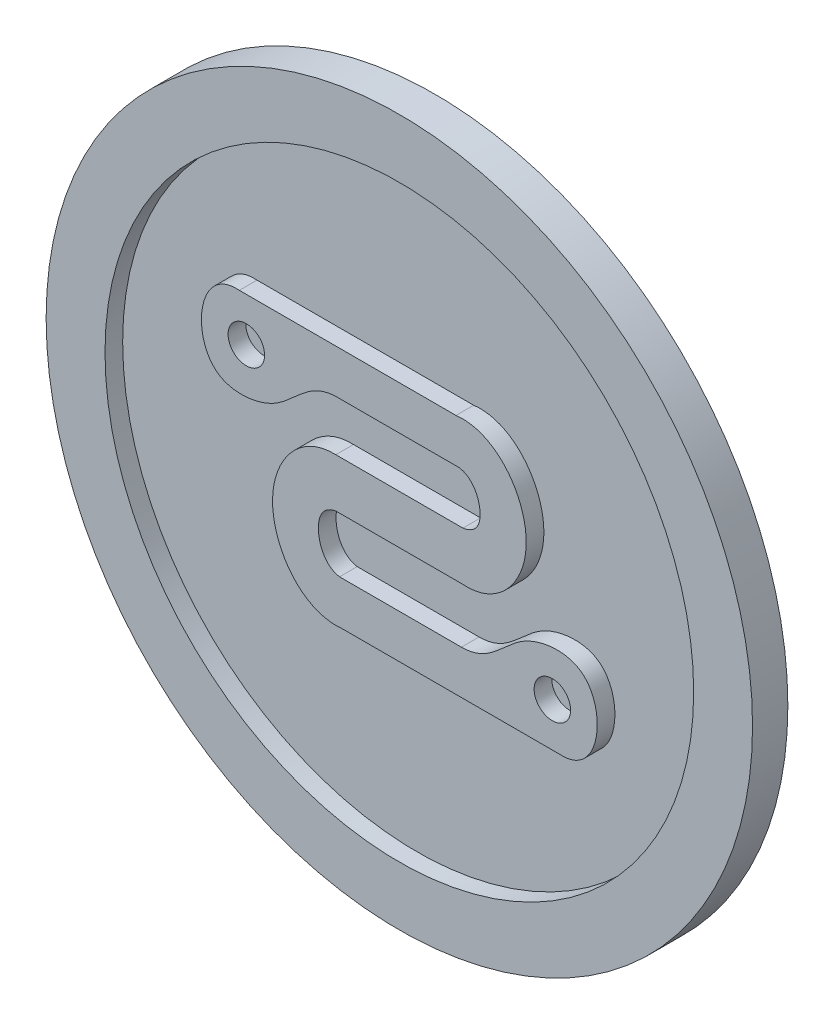
ISO-10303-21;
HEADER;
FILE_DESCRIPTION(('STEP AP214'),'2;1');
FILE_NAME('part.step','',(''),(''),'','','');
FILE_SCHEMA(('AUTOMOTIVE_DESIGN { 1 0 10303 214 1 1 1 1 }'));
ENDSEC;
DATA;
#1=APPLICATION_CONTEXT('core data for automotive mechanical design processes');
#2=APPLICATION_PROTOCOL_DEFINITION('international standard','automotive_design',2000,#1);
#3=PRODUCT_CONTEXT('',#1,'mechanical');
#4=PRODUCT('Part','Part','',(#3));
#5=PRODUCT_RELATED_PRODUCT_CATEGORY('part','',(#4));
#6=PRODUCT_DEFINITION_FORMATION('','',#4);
#7=PRODUCT_DEFINITION_CONTEXT('part definition',#1,'design');
#8=PRODUCT_DEFINITION('design','',#6,#7);
#9=PRODUCT_DEFINITION_SHAPE('','',#8);
#10=(LENGTH_UNIT() NAMED_UNIT(*) SI_UNIT(.MILLI.,.METRE.));
#11=(NAMED_UNIT(*) PLANE_ANGLE_UNIT() SI_UNIT($,.RADIAN.));
#12=(NAMED_UNIT(*) SI_UNIT($,.STERADIAN.) SOLID_ANGLE_UNIT());
#13=UNCERTAINTY_MEASURE_WITH_UNIT(LENGTH_MEASURE(1.E-05),#10,'distance_accuracy_value','');
#14=(GEOMETRIC_REPRESENTATION_CONTEXT(3) GLOBAL_UNCERTAINTY_ASSIGNED_CONTEXT((#13)) GLOBAL_UNIT_ASSIGNED_CONTEXT((#10,
#11,#12)) REPRESENTATION_CONTEXT('',''));
#15=CARTESIAN_POINT('',(0.,0.,0.));
#16=DIRECTION('',(0.,0.,1.));
#17=DIRECTION('',(1.,0.,0.));
#18=AXIS2_PLACEMENT_3D('',#15,#16,#17);
#19=CARTESIAN_POINT('',(0.,0.,3.));
#20=DIRECTION('',(0.,0.,1.));
#21=DIRECTION('',(1.,0.,0.));
#22=AXIS2_PLACEMENT_3D('',#19,#20,#21);
#23=PLANE('',#22);
#24=DIRECTION('',(-1.,0.,0.));
#25=VECTOR('',#24,1.);
#26=CARTESIAN_POINT('',(4.81247713559738,10.2600721933482,3.));
#27=LINE('',#26,#25);
#28=CARTESIAN_POINT('',(4.81247713559738,10.2600721933482,3.));
#29=VERTEX_POINT('',#28);
#30=CARTESIAN_POINT('',(-13.5902237681306,10.2600721933482,3.));
#31=VERTEX_POINT('',#30);
#32=EDGE_CURVE('E375',#29,#31,#27,.T.);
#33=ORIENTED_EDGE('',*,*,#32,.F.);
#34=CARTESIAN_POINT('',(5.40078826626582,-1.87322017180469,3.));
#35=CARTESIAN_POINT('',(8.33297042339554,-2.09037900537628,3.));
#36=CARTESIAN_POINT('',(13.1962569472052,3.73813739668233,3.));
#37=CARTESIAN_POINT('',(8.40871203136026,10.6879540547791,3.));
#38=CARTESIAN_POINT('',(4.81247713559738,10.2600721933482,3.));
#39=B_SPLINE_CURVE_WITH_KNOTS('',3,(#34,#35,#36,#37,#38),.UNSPECIFIED.,.F.,.F.,(4,1,4),(0.,
0.447523492962646,1.),.UNSPECIFIED.);
#40=CARTESIAN_POINT('',(5.40078826626582,-1.87322017180469,3.));
#41=VERTEX_POINT('',#40);
#42=EDGE_CURVE('E249',#41,#29,#39,.T.);
#43=ORIENTED_EDGE('',*,*,#42,.F.);
#44=DIRECTION('',(1.,0.,0.));
#45=VECTOR('',#44,1.);
#46=CARTESIAN_POINT('',(-5.39361505887175,-1.87322017180469,3.));
#47=LINE('',#46,#45);
#48=CARTESIAN_POINT('',(-5.39361505887175,-1.87322017180469,3.));
#49=VERTEX_POINT('',#48);
#50=EDGE_CURVE('E94',#49,#41,#47,.T.);
#51=ORIENTED_EDGE('',*,*,#50,.F.);
#52=CARTESIAN_POINT('',(-5.07768739122669,-6.55590596955314,3.));
#53=CARTESIAN_POINT('',(-6.10855302839654,-6.39291101821468,3.));
#54=CARTESIAN_POINT('',(-7.28525871768645,-4.38862566680623,3.));
#55=CARTESIAN_POINT('',(-6.70713013935386,-2.11162902555875,3.));
#56=CARTESIAN_POINT('',(-5.39361505887175,-1.87322017180469,3.));
#57=B_SPLINE_CURVE_WITH_KNOTS('',3,(#52,#53,#54,#55,#56),.UNSPECIFIED.,.F.,.F.,(4,1,4),(0.,
0.473540479435478,1.),.UNSPECIFIED.);
#58=CARTESIAN_POINT('',(-5.07768739122669,-6.55590596955314,3.));
#59=VERTEX_POINT('',#58);
#60=EDGE_CURVE('E336',#59,#49,#57,.T.);
#61=ORIENTED_EDGE('',*,*,#60,.F.);
#62=DIRECTION('',(-1.,0.,0.));
#63=VECTOR('',#62,1.);
#64=CARTESIAN_POINT('',(5.27212806558233,-6.55590596955241,3.));
#65=LINE('',#64,#63);
#66=CARTESIAN_POINT('',(5.27212806558233,-6.55590596955241,3.));
#67=VERTEX_POINT('',#66);
#68=EDGE_CURVE('E143',#67,#59,#65,.T.);
#69=ORIENTED_EDGE('',*,*,#68,.F.);
#70=CARTESIAN_POINT('',(13.5902237681325,-10.2600721933473,3.));
#71=CARTESIAN_POINT('',(17.1187453354098,-10.52591066691,3.));
#72=CARTESIAN_POINT('',(18.0368905734612,-2.0466923844399,3.));
#73=CARTESIAN_POINT('',(9.46259648060375,-2.82709767387034,3.));
#74=CARTESIAN_POINT('',(7.83733348320204,-6.54885981884074,3.));
#75=CARTESIAN_POINT('',(5.27212806558233,-6.55590596955241,3.));
#76=B_SPLINE_CURVE_WITH_KNOTS('',3,(#70,#71,#72,#73,#74,#75),.UNSPECIFIED.,.F.,.F.,(4,1,1,4),
(0.,0.432020752846675,0.673133157245239,1.),.UNSPECIFIED.);
#77=CARTESIAN_POINT('',(13.5902237681325,-10.2600721933473,3.));
#78=VERTEX_POINT('',#77);
#79=EDGE_CURVE('E344',#78,#67,#76,.T.);
#80=ORIENTED_EDGE('',*,*,#79,.F.);
#81=DIRECTION('',(1.,0.,0.));
#82=VECTOR('',#81,1.);
#83=CARTESIAN_POINT('',(-4.81247713559553,-10.2600721933486,3.));
#84=LINE('',#83,#82);
#85=CARTESIAN_POINT('',(-4.81247713559553,-10.2600721933486,3.));
#86=VERTEX_POINT('',#85);
#87=EDGE_CURVE('E348',#86,#78,#84,.T.);
#88=ORIENTED_EDGE('',*,*,#87,.F.);
#89=CARTESIAN_POINT('',(-5.39361505887203,2.26667859725923,3.));
#90=CARTESIAN_POINT('',(-8.39358250822431,2.37304743690197,3.));
#91=CARTESIAN_POINT('',(-13.1318080513393,-3.70534385048168,3.));
#92=CARTESIAN_POINT('',(-8.43662288996234,-10.6733705600057,3.));
#93=CARTESIAN_POINT('',(-4.81247713559553,-10.2600721933486,3.));
#94=B_SPLINE_CURVE_WITH_KNOTS('',3,(#89,#90,#91,#92,#93),.UNSPECIFIED.,.F.,.F.,(4,1,4),(0.,
0.455657255255285,1.),.UNSPECIFIED.);
#95=CARTESIAN_POINT('',(-5.39361505887203,2.26667859725923,3.));
#96=VERTEX_POINT('',#95);
#97=EDGE_CURVE('E353',#96,#86,#94,.T.);
#98=ORIENTED_EDGE('',*,*,#97,.F.);
#99=DIRECTION('',(-1.,0.,0.));
#100=VECTOR('',#99,1.);
#101=CARTESIAN_POINT('',(-5.39361505887203,2.26667859725923,3.));
#102=LINE('',#101,#100);
#103=CARTESIAN_POINT('',(5.40078826626582,2.26667859725923,3.));
#104=VERTEX_POINT('',#103);
#105=EDGE_CURVE('E357',#104,#96,#102,.T.);
#106=ORIENTED_EDGE('',*,*,#105,.F.);
#107=CARTESIAN_POINT('',(5.07768739122828,6.55590596955278,3.));
#108=CARTESIAN_POINT('',(6.09997823900049,6.399808672944,3.));
#109=CARTESIAN_POINT('',(7.25631066166367,4.47821057299144,3.));
#110=CARTESIAN_POINT('',(6.69316615326036,2.45998898256452,3.));
#111=CARTESIAN_POINT('',(5.40078826626582,2.26667859725923,3.));
#112=B_SPLINE_CURVE_WITH_KNOTS('',3,(#107,#108,#109,#110,#111),.UNSPECIFIED.,.F.,.F.,(4,1,4),
(0.,0.50520696272516,1.),.UNSPECIFIED.);
#113=CARTESIAN_POINT('',(5.07768739122828,6.55590596955278,3.));
#114=VERTEX_POINT('',#113);
#115=EDGE_CURVE('E362',#114,#104,#112,.T.);
#116=ORIENTED_EDGE('',*,*,#115,.F.);
#117=DIRECTION('',(1.,0.,0.));
#118=VECTOR('',#117,1.);
#119=CARTESIAN_POINT('',(-5.27212806558074,6.55590596955278,3.));
#120=LINE('',#119,#118);
#121=CARTESIAN_POINT('',(-5.27212806558074,6.55590596955278,3.));
#122=VERTEX_POINT('',#121);
#123=EDGE_CURVE('E366',#122,#114,#120,.T.);
#124=ORIENTED_EDGE('',*,*,#123,.F.);
#125=CARTESIAN_POINT('',(-13.5902237681306,10.2600721933482,3.));
#126=CARTESIAN_POINT('',(-17.1187453354079,10.5259106669112,3.));
#127=CARTESIAN_POINT('',(-18.0368905734599,2.04669238444117,3.));
#128=CARTESIAN_POINT('',(-9.46259648060242,2.82709767387101,3.));
#129=CARTESIAN_POINT('',(-7.83733348320045,6.54885981884129,3.));
#130=CARTESIAN_POINT('',(-5.27212806558074,6.55590596955278,3.));
#131=B_SPLINE_CURVE_WITH_KNOTS('',3,(#125,#126,#127,#128,#129,#130),.UNSPECIFIED.,.F.,.F.,(4,1,
1,4),(0.,0.432020752846675,0.673133157245239,1.),.UNSPECIFIED.);
#132=EDGE_CURVE('E371',#31,#122,#131,.T.);
#133=ORIENTED_EDGE('',*,*,#132,.F.);
#134=EDGE_LOOP('',(#33,#43,#51,#61,#69,#80,#88,#98,#106,#116,#124,#133));
#135=FACE_BOUND('',#134,.T.);
#136=CARTESIAN_POINT('',(0.,0.,3.));
#137=DIRECTION('',(0.,0.,1.));
#138=DIRECTION('',(1.,0.,0.));
#139=AXIS2_PLACEMENT_3D('',#136,#137,#138);
#140=CIRCLE('',#139,25.);
#141=CARTESIAN_POINT('',(25.,0.,3.));
#142=VERTEX_POINT('',#141);
#143=EDGE_CURVE('E11',#142,#142,#140,.F.);
#144=ORIENTED_EDGE('',*,*,#143,.F.);
#145=EDGE_LOOP('',(#144));
#146=FACE_BOUND('',#145,.T.);
#147=ADVANCED_FACE('F33',(#135,#146),#23,.T.);
#148=CARTESIAN_POINT('',(10.7606692875241,4.35288111850311,4.5));
#149=DIRECTION('',(0.,0.,1.));
#150=DIRECTION('',(1.,0.,0.));
#151=AXIS2_PLACEMENT_3D('',#148,#149,#150);
#152=PLANE('',#151);
#153=CARTESIAN_POINT('',(-12.9962056955768,6.55590596955278,4.5));
#154=DIRECTION('',(0.,0.,1.));
#155=DIRECTION('',(1.,0.,0.));
#156=AXIS2_PLACEMENT_3D('',#153,#154,#155);
#157=CIRCLE('',#156,1.54989693154997);
#158=CARTESIAN_POINT('',(-11.4463087640269,6.55590596955278,4.5));
#159=VERTEX_POINT('',#158);
#160=EDGE_CURVE('E243',#159,#159,#157,.T.);
#161=ORIENTED_EDGE('',*,*,#160,.F.);
#162=EDGE_LOOP('',(#161));
#163=FACE_BOUND('',#162,.T.);
#164=CARTESIAN_POINT('',(5.40078826626582,-1.87322017180469,4.5));
#165=CARTESIAN_POINT('',(8.33297042339554,-2.09037900537628,4.5));
#166=CARTESIAN_POINT('',(13.1962569472052,3.73813739668233,4.5));
#167=CARTESIAN_POINT('',(8.40871203136026,10.6879540547791,4.5));
#168=CARTESIAN_POINT('',(4.81247713559738,10.2600721933482,4.5));
#169=B_SPLINE_CURVE_WITH_KNOTS('',3,(#164,#165,#166,#167,#168),.UNSPECIFIED.,.F.,.F.,(4,1,4),
(0.,0.447523492962646,1.),.UNSPECIFIED.);
#170=CARTESIAN_POINT('',(5.40078826626582,-1.87322017180469,4.5));
#171=VERTEX_POINT('',#170);
#172=CARTESIAN_POINT('',(4.81247713559738,10.2600721933482,4.5));
#173=VERTEX_POINT('',#172);
#174=EDGE_CURVE('E238',#171,#173,#169,.T.);
#175=ORIENTED_EDGE('',*,*,#174,.T.);
#176=DIRECTION('',(-1.,0.,0.));
#177=VECTOR('',#176,1.);
#178=CARTESIAN_POINT('',(4.81247713559738,10.2600721933482,4.5));
#179=LINE('',#178,#177);
#180=CARTESIAN_POINT('',(-13.5902237681306,10.2600721933482,4.5));
#181=VERTEX_POINT('',#180);
#182=EDGE_CURVE('E102',#173,#181,#179,.T.);
#183=ORIENTED_EDGE('',*,*,#182,.T.);
#184=CARTESIAN_POINT('',(-13.5902237681306,10.2600721933482,4.5));
#185=CARTESIAN_POINT('',(-17.1187453354079,10.5259106669112,4.5));
#186=CARTESIAN_POINT('',(-18.0368905734599,2.04669238444117,4.5));
#187=CARTESIAN_POINT('',(-9.46259648060242,2.82709767387101,4.5));
#188=CARTESIAN_POINT('',(-7.83733348320045,6.54885981884129,4.5));
#189=CARTESIAN_POINT('',(-5.27212806558074,6.55590596955278,4.5));
#190=B_SPLINE_CURVE_WITH_KNOTS('',3,(#184,#185,#186,#187,#188,#189),.UNSPECIFIED.,.F.,.F.,(4,1,
1,4),(0.,0.432020752846675,0.673133157245239,1.),.UNSPECIFIED.);
#191=CARTESIAN_POINT('',(-5.27212806558074,6.55590596955278,4.5));
#192=VERTEX_POINT('',#191);
#193=EDGE_CURVE('E217',#181,#192,#190,.T.);
#194=ORIENTED_EDGE('',*,*,#193,.T.);
#195=DIRECTION('',(1.,0.,0.));
#196=VECTOR('',#195,1.);
#197=CARTESIAN_POINT('',(-5.27212806558074,6.55590596955278,4.5));
#198=LINE('',#197,#196);
#199=CARTESIAN_POINT('',(5.07768739122828,6.55590596955278,4.5));
#200=VERTEX_POINT('',#199);
#201=EDGE_CURVE('E212',#192,#200,#198,.T.);
#202=ORIENTED_EDGE('',*,*,#201,.T.);
#203=CARTESIAN_POINT('',(5.07768739122828,6.55590596955278,4.5));
#204=CARTESIAN_POINT('',(6.09997823900049,6.399808672944,4.5));
#205=CARTESIAN_POINT('',(7.25631066166367,4.47821057299144,4.5));
#206=CARTESIAN_POINT('',(6.69316615326036,2.45998898256452,4.5));
#207=CARTESIAN_POINT('',(5.40078826626582,2.26667859725923,4.5));
#208=B_SPLINE_CURVE_WITH_KNOTS('',3,(#203,#204,#205,#206,#207),.UNSPECIFIED.,.F.,.F.,(4,1,4),
(0.,0.50520696272516,1.),.UNSPECIFIED.);
#209=CARTESIAN_POINT('',(5.40078826626582,2.26667859725923,4.5));
#210=VERTEX_POINT('',#209);
#211=EDGE_CURVE('E207',#200,#210,#208,.T.);
#212=ORIENTED_EDGE('',*,*,#211,.T.);
#213=DIRECTION('',(-1.,0.,0.));
#214=VECTOR('',#213,1.);
#215=CARTESIAN_POINT('',(-5.39361505887203,2.26667859725923,4.5));
#216=LINE('',#215,#214);
#217=CARTESIAN_POINT('',(-5.39361505887203,2.26667859725923,4.5));
#218=VERTEX_POINT('',#217);
#219=EDGE_CURVE('E188',#210,#218,#216,.T.);
#220=ORIENTED_EDGE('',*,*,#219,.T.);
#221=CARTESIAN_POINT('',(-5.39361505887203,2.26667859725923,4.5));
#222=CARTESIAN_POINT('',(-8.39358250822431,2.37304743690197,4.5));
#223=CARTESIAN_POINT('',(-13.1318080513393,-3.70534385048168,4.5));
#224=CARTESIAN_POINT('',(-8.43662288996234,-10.6733705600057,4.5));
#225=CARTESIAN_POINT('',(-4.81247713559553,-10.2600721933486,4.5));
#226=B_SPLINE_CURVE_WITH_KNOTS('',3,(#221,#222,#223,#224,#225),.UNSPECIFIED.,.F.,.F.,(4,1,4),
(0.,0.455657255255285,1.),.UNSPECIFIED.);
#227=CARTESIAN_POINT('',(-4.81247713559553,-10.2600721933486,4.5));
#228=VERTEX_POINT('',#227);
#229=EDGE_CURVE('E183',#218,#228,#226,.T.);
#230=ORIENTED_EDGE('',*,*,#229,.T.);
#231=DIRECTION('',(1.,0.,0.));
#232=VECTOR('',#231,1.);
#233=CARTESIAN_POINT('',(-4.81247713559553,-10.2600721933486,4.5));
#234=LINE('',#233,#232);
#235=CARTESIAN_POINT('',(13.5902237681325,-10.2600721933473,4.5));
#236=VERTEX_POINT('',#235);
#237=EDGE_CURVE('E178',#228,#236,#234,.T.);
#238=ORIENTED_EDGE('',*,*,#237,.T.);
#239=CARTESIAN_POINT('',(13.5902237681325,-10.2600721933473,4.5));
#240=CARTESIAN_POINT('',(17.1187453354098,-10.52591066691,4.5));
#241=CARTESIAN_POINT('',(18.0368905734612,-2.0466923844399,4.5));
#242=CARTESIAN_POINT('',(9.46259648060375,-2.82709767387034,4.5));
#243=CARTESIAN_POINT('',(7.83733348320204,-6.54885981884074,4.5));
#244=CARTESIAN_POINT('',(5.27212806558233,-6.55590596955241,4.5));
#245=B_SPLINE_CURVE_WITH_KNOTS('',3,(#239,#240,#241,#242,#243,#244),.UNSPECIFIED.,.F.,.F.,(4,1,
1,4),(0.,0.432020752846675,0.673133157245239,1.),.UNSPECIFIED.);
#246=CARTESIAN_POINT('',(5.27212806558233,-6.55590596955241,4.5));
#247=VERTEX_POINT('',#246);
#248=EDGE_CURVE('E134',#236,#247,#245,.T.);
#249=ORIENTED_EDGE('',*,*,#248,.T.);
#250=DIRECTION('',(-1.,0.,0.));
#251=VECTOR('',#250,1.);
#252=CARTESIAN_POINT('',(5.27212806558233,-6.55590596955241,4.5));
#253=LINE('',#252,#251);
#254=CARTESIAN_POINT('',(-5.07768739122669,-6.55590596955314,4.5));
#255=VERTEX_POINT('',#254);
#256=EDGE_CURVE('E127',#247,#255,#253,.T.);
#257=ORIENTED_EDGE('',*,*,#256,.T.);
#258=CARTESIAN_POINT('',(-5.07768739122669,-6.55590596955314,4.5));
#259=CARTESIAN_POINT('',(-6.10855302839654,-6.39291101821468,4.5));
#260=CARTESIAN_POINT('',(-7.28525871768645,-4.38862566680623,4.5));
#261=CARTESIAN_POINT('',(-6.70713013935386,-2.11162902555875,4.5));
#262=CARTESIAN_POINT('',(-5.39361505887175,-1.87322017180469,4.5));
#263=B_SPLINE_CURVE_WITH_KNOTS('',3,(#258,#259,#260,#261,#262),.UNSPECIFIED.,.F.,.F.,(4,1,4),
(0.,0.473540479435478,1.),.UNSPECIFIED.);
#264=CARTESIAN_POINT('',(-5.39361505887175,-1.87322017180469,4.5));
#265=VERTEX_POINT('',#264);
#266=EDGE_CURVE('E132',#255,#265,#263,.T.);
#267=ORIENTED_EDGE('',*,*,#266,.T.);
#268=DIRECTION('',(1.,0.,0.));
#269=VECTOR('',#268,1.);
#270=CARTESIAN_POINT('',(-5.39361505887175,-1.87322017180469,4.5));
#271=LINE('',#270,#269);
#272=EDGE_CURVE('E56',#265,#171,#271,.T.);
#273=ORIENTED_EDGE('',*,*,#272,.T.);
#274=EDGE_LOOP('',(#175,#183,#194,#202,#212,#220,#230,#238,#249,#257,#267,#273));
#275=FACE_BOUND('',#274,.T.);
#276=CARTESIAN_POINT('',(12.9962056955768,-6.55590596955296,4.5));
#277=DIRECTION('',(0.,0.,1.));
#278=DIRECTION('',(1.,0.,0.));
#279=AXIS2_PLACEMENT_3D('',#276,#277,#278);
#280=CIRCLE('',#279,1.54989693154947);
#281=CARTESIAN_POINT('',(14.5461026271262,-6.55590596955296,4.5));
#282=VERTEX_POINT('',#281);
#283=EDGE_CURVE('E250',#282,#282,#280,.T.);
#284=ORIENTED_EDGE('',*,*,#283,.F.);
#285=EDGE_LOOP('',(#284));
#286=FACE_BOUND('',#285,.T.);
#287=ADVANCED_FACE('F129',(#163,#275,#286),#152,.T.);
#288=DIRECTION('',(0.,0.,-1.));
#289=VECTOR('',#288,1.);
#290=SURFACE_OF_LINEAR_EXTRUSION('',#169,#289);
#291=ORIENTED_EDGE('',*,*,#42,.T.);
#292=DIRECTION('',(0.,0.,-1.));
#293=VECTOR('',#292,1.);
#294=CARTESIAN_POINT('',(4.81247713559738,10.2600721933482,4.5));
#295=LINE('',#294,#293);
#296=EDGE_CURVE('E309',#173,#29,#295,.T.);
#297=ORIENTED_EDGE('',*,*,#296,.F.);
#298=ORIENTED_EDGE('',*,*,#174,.F.);
#299=DIRECTION('',(0.,0.,-1.));
#300=VECTOR('',#299,1.);
#301=CARTESIAN_POINT('',(5.40078826626582,-1.87322017180469,4.5));
#302=LINE('',#301,#300);
#303=EDGE_CURVE('E150',#171,#41,#302,.T.);
#304=ORIENTED_EDGE('',*,*,#303,.T.);
#305=EDGE_LOOP('',(#291,#297,#298,#304));
#306=FACE_BOUND('',#305,.T.);
#307=ADVANCED_FACE('F233',(#306),#290,.F.);
#308=CARTESIAN_POINT('',(4.81247713559738,10.2600721933482,4.5));
#309=DIRECTION('',(0.,-1.,0.));
#310=DIRECTION('',(0.,0.,-1.));
#311=AXIS2_PLACEMENT_3D('',#308,#309,#310);
#312=PLANE('',#311);
#313=ORIENTED_EDGE('',*,*,#32,.T.);
#314=DIRECTION('',(0.,0.,-1.));
#315=VECTOR('',#314,1.);
#316=CARTESIAN_POINT('',(-13.5902237681306,10.2600721933482,4.5));
#317=LINE('',#316,#315);
#318=EDGE_CURVE('E311',#181,#31,#317,.T.);
#319=ORIENTED_EDGE('',*,*,#318,.F.);
#320=ORIENTED_EDGE('',*,*,#182,.F.);
#321=ORIENTED_EDGE('',*,*,#296,.T.);
#322=EDGE_LOOP('',(#313,#319,#320,#321));
#323=FACE_BOUND('',#322,.T.);
#324=ADVANCED_FACE('F229',(#323),#312,.F.);
#325=DIRECTION('',(0.,0.,-1.));
#326=VECTOR('',#325,1.);
#327=SURFACE_OF_LINEAR_EXTRUSION('',#190,#326);
#328=ORIENTED_EDGE('',*,*,#132,.T.);
#329=DIRECTION('',(0.,0.,-1.));
#330=VECTOR('',#329,1.);
#331=CARTESIAN_POINT('',(-5.27212806558074,6.55590596955278,4.5));
#332=LINE('',#331,#330);
#333=EDGE_CURVE('E314',#192,#122,#332,.T.);
#334=ORIENTED_EDGE('',*,*,#333,.F.);
#335=ORIENTED_EDGE('',*,*,#193,.F.);
#336=ORIENTED_EDGE('',*,*,#318,.T.);
#337=EDGE_LOOP('',(#328,#334,#335,#336));
#338=FACE_BOUND('',#337,.T.);
#339=ADVANCED_FACE('F226',(#338),#327,.F.);
#340=CARTESIAN_POINT('',(-5.27212806558074,6.55590596955278,4.5));
#341=DIRECTION('',(0.,1.,0.));
#342=DIRECTION('',(0.,0.,1.));
#343=AXIS2_PLACEMENT_3D('',#340,#341,#342);
#344=PLANE('',#343);
#345=ORIENTED_EDGE('',*,*,#123,.T.);
#346=DIRECTION('',(0.,0.,-1.));
#347=VECTOR('',#346,1.);
#348=CARTESIAN_POINT('',(5.07768739122828,6.55590596955278,4.5));
#349=LINE('',#348,#347);
#350=EDGE_CURVE('E317',#200,#114,#349,.T.);
#351=ORIENTED_EDGE('',*,*,#350,.F.);
#352=ORIENTED_EDGE('',*,*,#201,.F.);
#353=ORIENTED_EDGE('',*,*,#333,.T.);
#354=EDGE_LOOP('',(#345,#351,#352,#353));
#355=FACE_BOUND('',#354,.T.);
#356=ADVANCED_FACE('F204',(#355),#344,.F.);
#357=DIRECTION('',(0.,0.,-1.));
#358=VECTOR('',#357,1.);
#359=SURFACE_OF_LINEAR_EXTRUSION('',#208,#358);
#360=ORIENTED_EDGE('',*,*,#115,.T.);
#361=DIRECTION('',(0.,0.,-1.));
#362=VECTOR('',#361,1.);
#363=CARTESIAN_POINT('',(5.40078826626582,2.26667859725923,4.5));
#364=LINE('',#363,#362);
#365=EDGE_CURVE('E320',#210,#104,#364,.T.);
#366=ORIENTED_EDGE('',*,*,#365,.F.);
#367=ORIENTED_EDGE('',*,*,#211,.F.);
#368=ORIENTED_EDGE('',*,*,#350,.T.);
#369=EDGE_LOOP('',(#360,#366,#367,#368));
#370=FACE_BOUND('',#369,.T.);
#371=ADVANCED_FACE('F200',(#370),#359,.F.);
#372=CARTESIAN_POINT('',(-5.39361505887203,2.26667859725923,4.5));
#373=DIRECTION('',(0.,-1.,0.));
#374=DIRECTION('',(0.,0.,-1.));
#375=AXIS2_PLACEMENT_3D('',#372,#373,#374);
#376=PLANE('',#375);
#377=ORIENTED_EDGE('',*,*,#105,.T.);
#378=DIRECTION('',(0.,0.,-1.));
#379=VECTOR('',#378,1.);
#380=CARTESIAN_POINT('',(-5.39361505887203,2.26667859725923,4.5));
#381=LINE('',#380,#379);
#382=EDGE_CURVE('E323',#218,#96,#381,.T.);
#383=ORIENTED_EDGE('',*,*,#382,.F.);
#384=ORIENTED_EDGE('',*,*,#219,.F.);
#385=ORIENTED_EDGE('',*,*,#365,.T.);
#386=EDGE_LOOP('',(#377,#383,#384,#385));
#387=FACE_BOUND('',#386,.T.);
#388=ADVANCED_FACE('F196',(#387),#376,.F.);
#389=DIRECTION('',(0.,0.,-1.));
#390=VECTOR('',#389,1.);
#391=SURFACE_OF_LINEAR_EXTRUSION('',#226,#390);
#392=ORIENTED_EDGE('',*,*,#97,.T.);
#393=DIRECTION('',(0.,0.,-1.));
#394=VECTOR('',#393,1.);
#395=CARTESIAN_POINT('',(-4.81247713559553,-10.2600721933486,4.5));
#396=LINE('',#395,#394);
#397=EDGE_CURVE('E326',#228,#86,#396,.T.);
#398=ORIENTED_EDGE('',*,*,#397,.F.);
#399=ORIENTED_EDGE('',*,*,#229,.F.);
#400=ORIENTED_EDGE('',*,*,#382,.T.);
#401=EDGE_LOOP('',(#392,#398,#399,#400));
#402=FACE_BOUND('',#401,.T.);
#403=ADVANCED_FACE('F193',(#402),#391,.F.);
#404=CARTESIAN_POINT('',(-4.81247713559553,-10.2600721933486,4.5));
#405=DIRECTION('',(0.,1.,0.));
#406=DIRECTION('',(-1.,0.,0.));
#407=AXIS2_PLACEMENT_3D('',#404,#405,#406);
#408=PLANE('',#407);
#409=ORIENTED_EDGE('',*,*,#87,.T.);
#410=DIRECTION('',(0.,0.,-1.));
#411=VECTOR('',#410,1.);
#412=CARTESIAN_POINT('',(13.5902237681325,-10.2600721933473,4.5));
#413=LINE('',#412,#411);
#414=EDGE_CURVE('E329',#236,#78,#413,.T.);
#415=ORIENTED_EDGE('',*,*,#414,.F.);
#416=ORIENTED_EDGE('',*,*,#237,.F.);
#417=ORIENTED_EDGE('',*,*,#397,.T.);
#418=EDGE_LOOP('',(#409,#415,#416,#417));
#419=FACE_BOUND('',#418,.T.);
#420=ADVANCED_FACE('F171',(#419),#408,.F.);
#421=DIRECTION('',(0.,0.,-1.));
#422=VECTOR('',#421,1.);
#423=SURFACE_OF_LINEAR_EXTRUSION('',#245,#422);
#424=ORIENTED_EDGE('',*,*,#79,.T.);
#425=DIRECTION('',(0.,0.,-1.));
#426=VECTOR('',#425,1.);
#427=CARTESIAN_POINT('',(5.27212806558233,-6.55590596955241,4.5));
#428=LINE('',#427,#426);
#429=EDGE_CURVE('E146',#247,#67,#428,.T.);
#430=ORIENTED_EDGE('',*,*,#429,.F.);
#431=ORIENTED_EDGE('',*,*,#248,.F.);
#432=ORIENTED_EDGE('',*,*,#414,.T.);
#433=EDGE_LOOP('',(#424,#430,#431,#432));
#434=FACE_BOUND('',#433,.T.);
#435=ADVANCED_FACE('F168',(#434),#423,.F.);
#436=CARTESIAN_POINT('',(5.27212806558233,-6.55590596955241,4.5));
#437=DIRECTION('',(0.,-1.,0.));
#438=DIRECTION('',(1.,0.,0.));
#439=AXIS2_PLACEMENT_3D('',#436,#437,#438);
#440=PLANE('',#439);
#441=ORIENTED_EDGE('',*,*,#68,.T.);
#442=DIRECTION('',(0.,0.,-1.));
#443=VECTOR('',#442,1.);
#444=CARTESIAN_POINT('',(-5.07768739122669,-6.55590596955314,4.5));
#445=LINE('',#444,#443);
#446=EDGE_CURVE('E140',#255,#59,#445,.T.);
#447=ORIENTED_EDGE('',*,*,#446,.F.);
#448=ORIENTED_EDGE('',*,*,#256,.F.);
#449=ORIENTED_EDGE('',*,*,#429,.T.);
#450=EDGE_LOOP('',(#441,#447,#448,#449));
#451=FACE_BOUND('',#450,.T.);
#452=ADVANCED_FACE('F141',(#451),#440,.F.);
#453=DIRECTION('',(0.,0.,-1.));
#454=VECTOR('',#453,1.);
#455=SURFACE_OF_LINEAR_EXTRUSION('',#263,#454);
#456=ORIENTED_EDGE('',*,*,#60,.T.);
#457=DIRECTION('',(0.,0.,-1.));
#458=VECTOR('',#457,1.);
#459=CARTESIAN_POINT('',(-5.39361505887175,-1.87322017180469,4.5));
#460=LINE('',#459,#458);
#461=EDGE_CURVE('E48',#265,#49,#460,.T.);
#462=ORIENTED_EDGE('',*,*,#461,.F.);
#463=ORIENTED_EDGE('',*,*,#266,.F.);
#464=ORIENTED_EDGE('',*,*,#446,.T.);
#465=EDGE_LOOP('',(#456,#462,#463,#464));
#466=FACE_BOUND('',#465,.T.);
#467=ADVANCED_FACE('F148',(#466),#455,.F.);
#468=CARTESIAN_POINT('',(-5.39361505887175,-1.87322017180469,4.5));
#469=DIRECTION('',(0.,1.,0.));
#470=DIRECTION('',(0.,0.,1.));
#471=AXIS2_PLACEMENT_3D('',#468,#469,#470);
#472=PLANE('',#471);
#473=ORIENTED_EDGE('',*,*,#50,.T.);
#474=ORIENTED_EDGE('',*,*,#303,.F.);
#475=ORIENTED_EDGE('',*,*,#272,.F.);
#476=ORIENTED_EDGE('',*,*,#461,.T.);
#477=EDGE_LOOP('',(#473,#474,#475,#476));
#478=FACE_BOUND('',#477,.T.);
#479=ADVANCED_FACE('F164',(#478),#472,.F.);
#480=CARTESIAN_POINT('',(-12.9962056955768,6.55590596955278,4.5));
#481=DIRECTION('',(0.,0.,-1.));
#482=DIRECTION('',(-1.,0.,0.));
#483=AXIS2_PLACEMENT_3D('',#480,#481,#482);
#484=CYLINDRICAL_SURFACE('',#483,1.54989693154997);
#485=ORIENTED_EDGE('',*,*,#160,.T.);
#486=EDGE_LOOP('',(#485));
#487=FACE_BOUND('',#486,.T.);
#488=CARTESIAN_POINT('',(-12.9962056955768,6.55590596955278,3.));
#489=DIRECTION('',(0.,0.,1.));
#490=DIRECTION('',(1.,0.,0.));
#491=AXIS2_PLACEMENT_3D('',#488,#489,#490);
#492=CIRCLE('',#491,1.54989693154997);
#493=CARTESIAN_POINT('',(-11.4463087640269,6.55590596955278,3.));
#494=VERTEX_POINT('',#493);
#495=EDGE_CURVE('E41',#494,#494,#492,.F.);
#496=ORIENTED_EDGE('',*,*,#495,.T.);
#497=EDGE_LOOP('',(#496));
#498=FACE_BOUND('',#497,.T.);
#499=ADVANCED_FACE('F291',(#487,#498),#484,.F.);
#500=CARTESIAN_POINT('',(12.9962056955768,-6.55590596955296,4.5));
#501=DIRECTION('',(0.,0.,-1.));
#502=DIRECTION('',(-1.,0.,0.));
#503=AXIS2_PLACEMENT_3D('',#500,#501,#502);
#504=CYLINDRICAL_SURFACE('',#503,1.54989693154947);
#505=ORIENTED_EDGE('',*,*,#283,.T.);
#506=EDGE_LOOP('',(#505));
#507=FACE_BOUND('',#506,.T.);
#508=CARTESIAN_POINT('',(12.9962056955768,-6.55590596955296,3.));
#509=DIRECTION('',(0.,0.,1.));
#510=DIRECTION('',(1.,0.,0.));
#511=AXIS2_PLACEMENT_3D('',#508,#509,#510);
#512=CIRCLE('',#511,1.54989693154947);
#513=CARTESIAN_POINT('',(14.5461026271262,-6.55590596955296,3.));
#514=VERTEX_POINT('',#513);
#515=EDGE_CURVE('E295',#514,#514,#512,.F.);
#516=ORIENTED_EDGE('',*,*,#515,.T.);
#517=EDGE_LOOP('',(#516));
#518=FACE_BOUND('',#517,.T.);
#519=ADVANCED_FACE('F286',(#507,#518),#504,.F.);
#520=ORIENTED_EDGE('',*,*,#515,.F.);
#521=EDGE_LOOP('',(#520));
#522=FACE_BOUND('',#521,.T.);
#523=ADVANCED_FACE('F274',(#522),#23,.T.);
#524=ORIENTED_EDGE('',*,*,#495,.F.);
#525=EDGE_LOOP('',(#524));
#526=FACE_BOUND('',#525,.T.);
#527=ADVANCED_FACE('F265',(#526),#23,.T.);
#528=CARTESIAN_POINT('',(0.,0.,4.5));
#529=DIRECTION('',(0.,0.,1.));
#530=DIRECTION('',(1.,0.,0.));
#531=AXIS2_PLACEMENT_3D('',#528,#529,#530);
#532=PLANE('',#531);
#533=CARTESIAN_POINT('',(0.,0.,4.5));
#534=DIRECTION('',(0.,0.,1.));
#535=DIRECTION('',(1.,0.,0.));
#536=AXIS2_PLACEMENT_3D('',#533,#534,#535);
#537=CIRCLE('',#536,30.);
#538=CARTESIAN_POINT('',(30.,0.,4.5));
#539=VERTEX_POINT('',#538);
#540=EDGE_CURVE('E253',#539,#539,#537,.T.);
#541=ORIENTED_EDGE('',*,*,#540,.T.);
#542=EDGE_LOOP('',(#541));
#543=FACE_BOUND('',#542,.T.);
#544=CARTESIAN_POINT('',(0.,0.,4.5));
#545=DIRECTION('',(0.,0.,1.));
#546=DIRECTION('',(1.,0.,0.));
#547=AXIS2_PLACEMENT_3D('',#544,#545,#546);
#548=CIRCLE('',#547,25.);
#549=CARTESIAN_POINT('',(25.,0.,4.5));
#550=VERTEX_POINT('',#549);
#551=EDGE_CURVE('E256',#550,#550,#548,.T.);
#552=ORIENTED_EDGE('',*,*,#551,.F.);
#553=EDGE_LOOP('',(#552));
#554=FACE_BOUND('',#553,.T.);
#555=ADVANCED_FACE('F263',(#543,#554),#532,.T.);
#556=CARTESIAN_POINT('',(0.,0.,4.5));
#557=DIRECTION('',(0.,0.,-1.));
#558=DIRECTION('',(-1.,0.,0.));
#559=AXIS2_PLACEMENT_3D('',#556,#557,#558);
#560=CYLINDRICAL_SURFACE('',#559,25.);
#561=ORIENTED_EDGE('',*,*,#551,.T.);
#562=EDGE_LOOP('',(#561));
#563=FACE_BOUND('',#562,.T.);
#564=ORIENTED_EDGE('',*,*,#143,.T.);
#565=EDGE_LOOP('',(#564));
#566=FACE_BOUND('',#565,.T.);
#567=ADVANCED_FACE('F260',(#563,#566),#560,.F.);
#568=CARTESIAN_POINT('',(0.,0.,0.));
#569=DIRECTION('',(0.,0.,1.));
#570=DIRECTION('',(1.,0.,0.));
#571=AXIS2_PLACEMENT_3D('',#568,#569,#570);
#572=PLANE('',#571);
#573=CARTESIAN_POINT('',(0.,0.,0.));
#574=DIRECTION('',(0.,0.,1.));
#575=DIRECTION('',(1.,0.,0.));
#576=AXIS2_PLACEMENT_3D('',#573,#574,#575);
#577=CIRCLE('',#576,15.);
#578=CARTESIAN_POINT('',(15.,0.,0.));
#579=VERTEX_POINT('',#578);
#580=EDGE_CURVE('E301',#579,#579,#577,.T.);
#581=ORIENTED_EDGE('',*,*,#580,.F.);
#582=EDGE_LOOP('',(#581));
#583=FACE_BOUND('',#582,.T.);
#584=ADVANCED_FACE('F272',(#583),#572,.F.);
#585=CARTESIAN_POINT('',(0.,0.,1.5));
#586=DIRECTION('',(0.,0.,-1.));
#587=DIRECTION('',(-1.,0.,0.));
#588=AXIS2_PLACEMENT_3D('',#585,#586,#587);
#589=CYLINDRICAL_SURFACE('',#588,15.);
#590=CARTESIAN_POINT('',(0.,0.,1.5));
#591=DIRECTION('',(0.,0.,1.));
#592=DIRECTION('',(1.,0.,0.));
#593=AXIS2_PLACEMENT_3D('',#590,#591,#592);
#594=CIRCLE('',#593,15.);
#595=CARTESIAN_POINT('',(15.,0.,1.5));
#596=VERTEX_POINT('',#595);
#597=EDGE_CURVE('E297',#596,#596,#594,.T.);
#598=ORIENTED_EDGE('',*,*,#597,.F.);
#599=EDGE_LOOP('',(#598));
#600=FACE_BOUND('',#599,.T.);
#601=ORIENTED_EDGE('',*,*,#580,.T.);
#602=EDGE_LOOP('',(#601));
#603=FACE_BOUND('',#602,.T.);
#604=ADVANCED_FACE('F35',(#600,#603),#589,.T.);
#605=CARTESIAN_POINT('',(0.,0.,1.5));
#606=DIRECTION('',(0.,0.,1.));
#607=DIRECTION('',(1.,0.,0.));
#608=AXIS2_PLACEMENT_3D('',#605,#606,#607);
#609=PLANE('',#608);
#610=ORIENTED_EDGE('',*,*,#597,.T.);
#611=EDGE_LOOP('',(#610));
#612=FACE_BOUND('',#611,.T.);
#613=CARTESIAN_POINT('',(0.,0.,1.5));
#614=DIRECTION('',(0.,0.,1.));
#615=DIRECTION('',(1.,0.,0.));
#616=AXIS2_PLACEMENT_3D('',#613,#614,#615);
#617=CIRCLE('',#616,30.);
#618=CARTESIAN_POINT('',(30.,0.,1.5));
#619=VERTEX_POINT('',#618);
#620=EDGE_CURVE('E305',#619,#619,#617,.T.);
#621=ORIENTED_EDGE('',*,*,#620,.F.);
#622=EDGE_LOOP('',(#621));
#623=FACE_BOUND('',#622,.T.);
#624=ADVANCED_FACE('F478',(#612,#623),#609,.F.);
#625=CARTESIAN_POINT('',(0.,0.,3.));
#626=DIRECTION('',(0.,0.,-1.));
#627=DIRECTION('',(-1.,0.,0.));
#628=AXIS2_PLACEMENT_3D('',#625,#626,#627);
#629=CYLINDRICAL_SURFACE('',#628,30.);
#630=ORIENTED_EDGE('',*,*,#620,.T.);
#631=EDGE_LOOP('',(#630));
#632=FACE_BOUND('',#631,.T.);
#633=ORIENTED_EDGE('',*,*,#540,.F.);
#634=EDGE_LOOP('',(#633));
#635=FACE_BOUND('',#634,.T.);
#636=ADVANCED_FACE('F475',(#632,#635),#629,.T.);
#637=CLOSED_SHELL('',(#147,#287,#307,#324,#339,#356,#371,#388,#403,#420,#435,#452,#467,#479,
#499,#519,#523,#527,#555,#567,#584,#604,#624,#636));
#638=MANIFOLD_SOLID_BREP('B2',#637);
#639=ADVANCED_BREP_SHAPE_REPRESENTATION('',(#18,#638),#14);
#640=SHAPE_DEFINITION_REPRESENTATION(#9,#639);
ENDSEC;
END-ISO-10303-21;
